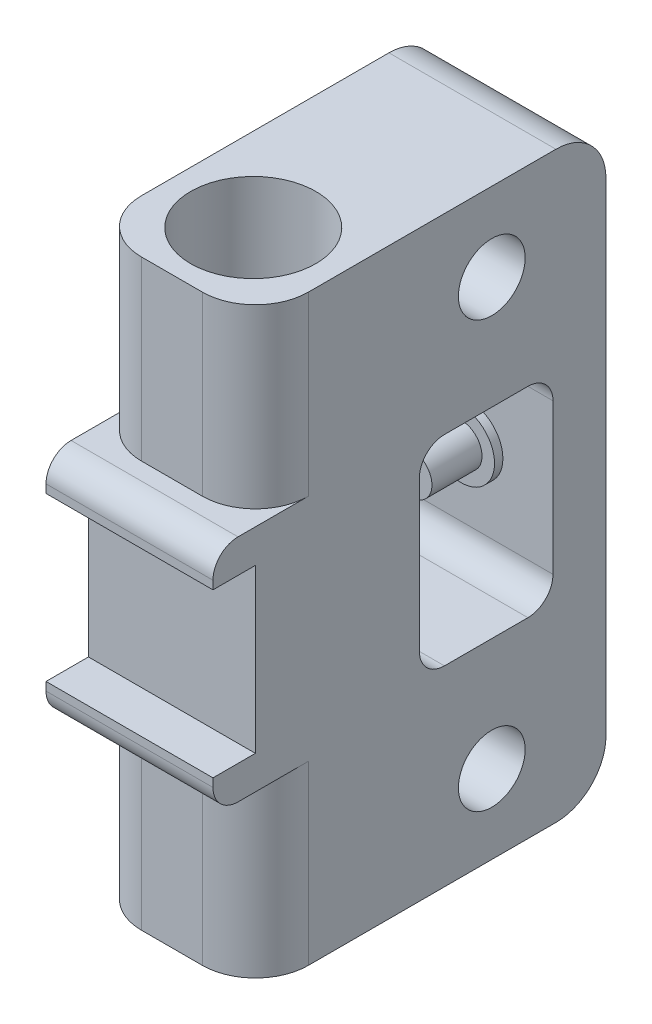
ISO-10303-21;
HEADER;
FILE_DESCRIPTION(('STEP AP214'),'2;1');
FILE_NAME('part.step','',(''),(''),'','','');
FILE_SCHEMA(('AUTOMOTIVE_DESIGN { 1 0 10303 214 1 1 1 1 }'));
ENDSEC;
DATA;
#1=APPLICATION_CONTEXT('core data for automotive mechanical design processes');
#2=APPLICATION_PROTOCOL_DEFINITION('international standard','automotive_design',2000,#1);
#3=PRODUCT_CONTEXT('',#1,'mechanical');
#4=PRODUCT('Part','Part','',(#3));
#5=PRODUCT_RELATED_PRODUCT_CATEGORY('part','',(#4));
#6=PRODUCT_DEFINITION_FORMATION('','',#4);
#7=PRODUCT_DEFINITION_CONTEXT('part definition',#1,'design');
#8=PRODUCT_DEFINITION('design','',#6,#7);
#9=PRODUCT_DEFINITION_SHAPE('','',#8);
#10=(LENGTH_UNIT() NAMED_UNIT(*) SI_UNIT(.MILLI.,.METRE.));
#11=(NAMED_UNIT(*) PLANE_ANGLE_UNIT() SI_UNIT($,.RADIAN.));
#12=(NAMED_UNIT(*) SI_UNIT($,.STERADIAN.) SOLID_ANGLE_UNIT());
#13=UNCERTAINTY_MEASURE_WITH_UNIT(LENGTH_MEASURE(1.E-05),#10,'distance_accuracy_value','');
#14=(GEOMETRIC_REPRESENTATION_CONTEXT(3) GLOBAL_UNCERTAINTY_ASSIGNED_CONTEXT((#13)) GLOBAL_UNIT_ASSIGNED_CONTEXT((#10,
#11,#12)) REPRESENTATION_CONTEXT('',''));
#15=CARTESIAN_POINT('',(0.,0.,0.));
#16=DIRECTION('',(0.,0.,1.));
#17=DIRECTION('',(1.,0.,0.));
#18=AXIS2_PLACEMENT_3D('',#15,#16,#17);
#19=CARTESIAN_POINT('',(-10.,69.85,21.));
#20=DIRECTION('',(0.,0.,-1.));
#21=DIRECTION('',(-1.,0.,0.));
#22=AXIS2_PLACEMENT_3D('',#19,#20,#21);
#23=PLANE('',#22);
#24=DIRECTION('',(-1.,0.,0.));
#25=VECTOR('',#24,1.);
#26=CARTESIAN_POINT('',(-10.,48.675,21.));
#27=LINE('',#26,#25);
#28=CARTESIAN_POINT('',(3.65,48.675,21.));
#29=VERTEX_POINT('',#28);
#30=CARTESIAN_POINT('',(-3.65,48.675,21.));
#31=VERTEX_POINT('',#30);
#32=EDGE_CURVE('E249',#29,#31,#27,.T.);
#33=ORIENTED_EDGE('',*,*,#32,.F.);
#34=DIRECTION('',(0.,-1.,0.));
#35=VECTOR('',#34,1.);
#36=CARTESIAN_POINT('',(3.65,69.85,21.));
#37=LINE('',#36,#35);
#38=CARTESIAN_POINT('',(3.65,69.85,21.));
#39=VERTEX_POINT('',#38);
#40=EDGE_CURVE('E366',#29,#39,#37,.F.);
#41=ORIENTED_EDGE('',*,*,#40,.T.);
#42=DIRECTION('',(1.,0.,0.));
#43=VECTOR('',#42,1.);
#44=CARTESIAN_POINT('',(-10.,69.85,21.));
#45=LINE('',#44,#43);
#46=CARTESIAN_POINT('',(-3.65,69.85,21.));
#47=VERTEX_POINT('',#46);
#48=EDGE_CURVE('E338',#47,#39,#45,.T.);
#49=ORIENTED_EDGE('',*,*,#48,.F.);
#50=DIRECTION('',(0.,-1.,0.));
#51=VECTOR('',#50,1.);
#52=CARTESIAN_POINT('',(-3.65,69.85,21.));
#53=LINE('',#52,#51);
#54=EDGE_CURVE('E363',#47,#31,#53,.T.);
#55=ORIENTED_EDGE('',*,*,#54,.T.);
#56=EDGE_LOOP('',(#33,#41,#49,#55));
#57=FACE_BOUND('',#56,.T.);
#58=ADVANCED_FACE('F32',(#57),#23,.F.);
#59=DIRECTION('',(1.,0.,0.));
#60=VECTOR('',#59,1.);
#61=CARTESIAN_POINT('',(-10.,44.675,21.));
#62=LINE('',#61,#60);
#63=CARTESIAN_POINT('',(-10.,44.675,21.));
#64=VERTEX_POINT('',#63);
#65=CARTESIAN_POINT('',(10.,44.675,21.));
#66=VERTEX_POINT('',#65);
#67=EDGE_CURVE('E227',#64,#66,#62,.T.);
#68=ORIENTED_EDGE('',*,*,#67,.F.);
#69=DIRECTION('',(0.,-1.,0.));
#70=VECTOR('',#69,1.);
#71=CARTESIAN_POINT('',(-10.,21.175,21.));
#72=LINE('',#71,#70);
#73=CARTESIAN_POINT('',(-10.,25.175,21.));
#74=VERTEX_POINT('',#73);
#75=EDGE_CURVE('E235',#64,#74,#72,.T.);
#76=ORIENTED_EDGE('',*,*,#75,.T.);
#77=DIRECTION('',(-1.,0.,0.));
#78=VECTOR('',#77,1.);
#79=CARTESIAN_POINT('',(-10.,25.175,21.));
#80=LINE('',#79,#78);
#81=CARTESIAN_POINT('',(10.,25.175,21.));
#82=VERTEX_POINT('',#81);
#83=EDGE_CURVE('E259',#82,#74,#80,.T.);
#84=ORIENTED_EDGE('',*,*,#83,.F.);
#85=DIRECTION('',(0.,1.,0.));
#86=VECTOR('',#85,1.);
#87=CARTESIAN_POINT('',(10.,21.175,21.));
#88=LINE('',#87,#86);
#89=EDGE_CURVE('E273',#82,#66,#88,.T.);
#90=ORIENTED_EDGE('',*,*,#89,.T.);
#91=EDGE_LOOP('',(#68,#76,#84,#90));
#92=FACE_BOUND('',#91,.T.);
#93=ADVANCED_FACE('F520',(#92),#23,.F.);
#94=DIRECTION('',(1.,0.,0.));
#95=VECTOR('',#94,1.);
#96=CARTESIAN_POINT('',(-10.,21.175,21.));
#97=LINE('',#96,#95);
#98=CARTESIAN_POINT('',(-3.65,21.175,21.));
#99=VERTEX_POINT('',#98);
#100=CARTESIAN_POINT('',(3.65,21.175,21.));
#101=VERTEX_POINT('',#100);
#102=EDGE_CURVE('E238',#99,#101,#97,.T.);
#103=ORIENTED_EDGE('',*,*,#102,.F.);
#104=CARTESIAN_POINT('',(-3.65,0.,21.));
#105=VERTEX_POINT('',#104);
#106=EDGE_CURVE('E362',#99,#105,#53,.T.);
#107=ORIENTED_EDGE('',*,*,#106,.T.);
#108=DIRECTION('',(1.,0.,0.));
#109=VECTOR('',#108,1.);
#110=CARTESIAN_POINT('',(-10.,0.,21.));
#111=LINE('',#110,#109);
#112=CARTESIAN_POINT('',(3.65,0.,21.));
#113=VERTEX_POINT('',#112);
#114=EDGE_CURVE('E335',#105,#113,#111,.T.);
#115=ORIENTED_EDGE('',*,*,#114,.T.);
#116=EDGE_CURVE('E367',#113,#101,#37,.F.);
#117=ORIENTED_EDGE('',*,*,#116,.T.);
#118=EDGE_LOOP('',(#103,#107,#115,#117));
#119=FACE_BOUND('',#118,.T.);
#120=ADVANCED_FACE('F522',(#119),#23,.F.);
#121=CARTESIAN_POINT('',(3.65,69.85,14.65));
#122=DIRECTION('',(0.,-1.,0.));
#123=DIRECTION('',(0.,0.,-1.));
#124=AXIS2_PLACEMENT_3D('',#121,#122,#123);
#125=CYLINDRICAL_SURFACE('',#124,6.35);
#126=CARTESIAN_POINT('',(3.65,48.675,14.65));
#127=DIRECTION('',(0.,1.,0.));
#128=DIRECTION('',(0.,0.,1.));
#129=AXIS2_PLACEMENT_3D('',#126,#127,#128);
#130=CIRCLE('',#129,6.35);
#131=CARTESIAN_POINT('',(10.,48.675,14.65));
#132=VERTEX_POINT('',#131);
#133=EDGE_CURVE('E288',#132,#29,#130,.F.);
#134=ORIENTED_EDGE('',*,*,#133,.F.);
#135=DIRECTION('',(0.,-1.,0.));
#136=VECTOR('',#135,1.);
#137=CARTESIAN_POINT('',(10.,69.85,14.65));
#138=LINE('',#137,#136);
#139=CARTESIAN_POINT('',(10.,69.85,14.65));
#140=VERTEX_POINT('',#139);
#141=EDGE_CURVE('E354',#140,#132,#138,.T.);
#142=ORIENTED_EDGE('',*,*,#141,.F.);
#143=CARTESIAN_POINT('',(3.65,69.85,14.65));
#144=DIRECTION('',(0.,-1.,0.));
#145=DIRECTION('',(0.,0.,-1.));
#146=AXIS2_PLACEMENT_3D('',#143,#144,#145);
#147=CIRCLE('',#146,6.35);
#148=EDGE_CURVE('E372',#39,#140,#147,.F.);
#149=ORIENTED_EDGE('',*,*,#148,.F.);
#150=ORIENTED_EDGE('',*,*,#40,.F.);
#151=EDGE_LOOP('',(#134,#142,#149,#150));
#152=FACE_BOUND('',#151,.T.);
#153=ADVANCED_FACE('F504',(#152),#125,.T.);
#154=CARTESIAN_POINT('',(-3.65,69.85,14.65));
#155=DIRECTION('',(0.,-1.,0.));
#156=DIRECTION('',(0.,0.,-1.));
#157=AXIS2_PLACEMENT_3D('',#154,#155,#156);
#158=CYLINDRICAL_SURFACE('',#157,6.35);
#159=CARTESIAN_POINT('',(-3.65,48.675,14.65));
#160=DIRECTION('',(0.,1.,0.));
#161=DIRECTION('',(0.,0.,1.));
#162=AXIS2_PLACEMENT_3D('',#159,#160,#161);
#163=CIRCLE('',#162,6.35);
#164=CARTESIAN_POINT('',(-10.,48.675,14.65));
#165=VERTEX_POINT('',#164);
#166=EDGE_CURVE('E447',#31,#165,#163,.F.);
#167=ORIENTED_EDGE('',*,*,#166,.F.);
#168=ORIENTED_EDGE('',*,*,#54,.F.);
#169=CARTESIAN_POINT('',(-3.65,69.85,14.65));
#170=DIRECTION('',(0.,-1.,0.));
#171=DIRECTION('',(0.,0.,-1.));
#172=AXIS2_PLACEMENT_3D('',#169,#170,#171);
#173=CIRCLE('',#172,6.35);
#174=CARTESIAN_POINT('',(-10.,69.85,14.65));
#175=VERTEX_POINT('',#174);
#176=EDGE_CURVE('E370',#175,#47,#173,.F.);
#177=ORIENTED_EDGE('',*,*,#176,.F.);
#178=DIRECTION('',(0.,-1.,0.));
#179=VECTOR('',#178,1.);
#180=CARTESIAN_POINT('',(-10.,69.85,14.65));
#181=LINE('',#180,#179);
#182=EDGE_CURVE('E374',#165,#175,#181,.F.);
#183=ORIENTED_EDGE('',*,*,#182,.F.);
#184=EDGE_LOOP('',(#167,#168,#177,#183));
#185=FACE_BOUND('',#184,.T.);
#186=ADVANCED_FACE('F516',(#185),#158,.T.);
#187=CARTESIAN_POINT('',(10.,69.85,21.));
#188=DIRECTION('',(-1.,0.,0.));
#189=DIRECTION('',(0.,0.,1.));
#190=AXIS2_PLACEMENT_3D('',#187,#188,#189);
#191=PLANE('',#190);
#192=DIRECTION('',(0.,0.,1.));
#193=VECTOR('',#192,1.);
#194=CARTESIAN_POINT('',(10.,48.675,14.65));
#195=LINE('',#194,#193);
#196=CARTESIAN_POINT('',(10.,48.675,23.08));
#197=VERTEX_POINT('',#196);
#198=EDGE_CURVE('E280',#132,#197,#195,.T.);
#199=ORIENTED_EDGE('',*,*,#198,.T.);
#200=CARTESIAN_POINT('',(10.,45.675,23.08));
#201=DIRECTION('',(-1.,0.,0.));
#202=DIRECTION('',(0.,0.,1.));
#203=AXIS2_PLACEMENT_3D('',#200,#201,#202);
#204=CIRCLE('',#203,3.);
#205=CARTESIAN_POINT('',(10.,45.675,26.08));
#206=VERTEX_POINT('',#205);
#207=EDGE_CURVE('E457',#197,#206,#204,.F.);
#208=ORIENTED_EDGE('',*,*,#207,.T.);
#209=DIRECTION('',(0.,1.,0.));
#210=VECTOR('',#209,1.);
#211=CARTESIAN_POINT('',(10.,48.675,26.08));
#212=LINE('',#211,#210);
#213=CARTESIAN_POINT('',(10.,44.675,26.08));
#214=VERTEX_POINT('',#213);
#215=EDGE_CURVE('E244',#214,#206,#212,.T.);
#216=ORIENTED_EDGE('',*,*,#215,.F.);
#217=DIRECTION('',(0.,0.,-1.));
#218=VECTOR('',#217,1.);
#219=CARTESIAN_POINT('',(10.,44.675,26.08));
#220=LINE('',#219,#218);
#221=EDGE_CURVE('E239',#214,#66,#220,.T.);
#222=ORIENTED_EDGE('',*,*,#221,.T.);
#223=ORIENTED_EDGE('',*,*,#89,.F.);
#224=DIRECTION('',(0.,0.,-1.));
#225=VECTOR('',#224,1.);
#226=CARTESIAN_POINT('',(10.,25.175,26.08));
#227=LINE('',#226,#225);
#228=CARTESIAN_POINT('',(10.,25.175,26.08));
#229=VERTEX_POINT('',#228);
#230=EDGE_CURVE('E269',#229,#82,#227,.T.);
#231=ORIENTED_EDGE('',*,*,#230,.F.);
#232=DIRECTION('',(0.,1.,0.));
#233=VECTOR('',#232,1.);
#234=CARTESIAN_POINT('',(10.,21.175,26.08));
#235=LINE('',#234,#233);
#236=CARTESIAN_POINT('',(10.,24.175,26.08));
#237=VERTEX_POINT('',#236);
#238=EDGE_CURVE('E258',#237,#229,#235,.T.);
#239=ORIENTED_EDGE('',*,*,#238,.F.);
#240=CARTESIAN_POINT('',(10.,24.175,23.08));
#241=DIRECTION('',(-1.,0.,0.));
#242=DIRECTION('',(0.,0.,1.));
#243=AXIS2_PLACEMENT_3D('',#240,#241,#242);
#244=CIRCLE('',#243,3.);
#245=CARTESIAN_POINT('',(10.,21.175,23.08));
#246=VERTEX_POINT('',#245);
#247=EDGE_CURVE('E47',#237,#246,#244,.F.);
#248=ORIENTED_EDGE('',*,*,#247,.T.);
#249=DIRECTION('',(0.,0.,1.));
#250=VECTOR('',#249,1.);
#251=CARTESIAN_POINT('',(10.,21.175,14.65));
#252=LINE('',#251,#250);
#253=CARTESIAN_POINT('',(10.,21.175,14.65));
#254=VERTEX_POINT('',#253);
#255=EDGE_CURVE('E283',#254,#246,#252,.T.);
#256=ORIENTED_EDGE('',*,*,#255,.F.);
#257=CARTESIAN_POINT('',(10.,0.,14.65));
#258=VERTEX_POINT('',#257);
#259=EDGE_CURVE('E353',#254,#258,#138,.T.);
#260=ORIENTED_EDGE('',*,*,#259,.T.);
#261=DIRECTION('',(0.,0.,-1.));
#262=VECTOR('',#261,1.);
#263=CARTESIAN_POINT('',(10.,0.,21.));
#264=LINE('',#263,#262);
#265=CARTESIAN_POINT('',(10.,0.,-15.));
#266=VERTEX_POINT('',#265);
#267=EDGE_CURVE('E330',#258,#266,#264,.T.);
#268=ORIENTED_EDGE('',*,*,#267,.T.);
#269=CARTESIAN_POINT('',(10.,6.00000000000001,-15.));
#270=DIRECTION('',(-1.,0.,0.));
#271=DIRECTION('',(0.,0.,1.));
#272=AXIS2_PLACEMENT_3D('',#269,#270,#271);
#273=CIRCLE('',#272,6.);
#274=CARTESIAN_POINT('',(10.,6.00000000000001,-21.));
#275=VERTEX_POINT('',#274);
#276=EDGE_CURVE('E399',#266,#275,#273,.F.);
#277=ORIENTED_EDGE('',*,*,#276,.T.);
#278=DIRECTION('',(0.,-1.,0.));
#279=VECTOR('',#278,1.);
#280=CARTESIAN_POINT('',(10.,69.85,-21.));
#281=LINE('',#280,#279);
#282=CARTESIAN_POINT('',(10.,63.85,-21.));
#283=VERTEX_POINT('',#282);
#284=EDGE_CURVE('E350',#283,#275,#281,.T.);
#285=ORIENTED_EDGE('',*,*,#284,.F.);
#286=CARTESIAN_POINT('',(10.,63.85,-15.));
#287=DIRECTION('',(-1.,0.,0.));
#288=DIRECTION('',(0.,0.,1.));
#289=AXIS2_PLACEMENT_3D('',#286,#287,#288);
#290=CIRCLE('',#289,6.);
#291=CARTESIAN_POINT('',(10.,69.85,-15.));
#292=VERTEX_POINT('',#291);
#293=EDGE_CURVE('E401',#283,#292,#290,.F.);
#294=ORIENTED_EDGE('',*,*,#293,.T.);
#295=DIRECTION('',(0.,0.,-1.));
#296=VECTOR('',#295,1.);
#297=CARTESIAN_POINT('',(10.,69.85,21.));
#298=LINE('',#297,#296);
#299=EDGE_CURVE('E331',#140,#292,#298,.T.);
#300=ORIENTED_EDGE('',*,*,#299,.F.);
#301=ORIENTED_EDGE('',*,*,#141,.T.);
#302=EDGE_LOOP('',(#199,#208,#216,#222,#223,#231,#239,#248,#256,#260,#268,#277,#285,#294,#300,#301));
#303=FACE_BOUND('',#302,.T.);
#304=CARTESIAN_POINT('',(10.,60.425,-7.31821536224331));
#305=DIRECTION('',(1.,0.,0.));
#306=DIRECTION('',(0.,0.,-1.));
#307=AXIS2_PLACEMENT_3D('',#304,#305,#306);
#308=CIRCLE('',#307,4.);
#309=CARTESIAN_POINT('',(10.,60.425,-11.3182153622433));
#310=VERTEX_POINT('',#309);
#311=EDGE_CURVE('E311',#310,#310,#308,.T.);
#312=ORIENTED_EDGE('',*,*,#311,.F.);
#313=EDGE_LOOP('',(#312));
#314=FACE_BOUND('',#313,.T.);
#315=CARTESIAN_POINT('',(10.,43.925,-11.65));
#316=DIRECTION('',(-1.,0.,0.));
#317=DIRECTION('',(0.,0.,1.));
#318=AXIS2_PLACEMENT_3D('',#315,#316,#317);
#319=CIRCLE('',#318,3.);
#320=CARTESIAN_POINT('',(10.,46.925,-11.65));
#321=VERTEX_POINT('',#320);
#322=CARTESIAN_POINT('',(10.,43.925,-14.65));
#323=VERTEX_POINT('',#322);
#324=EDGE_CURVE('E426',#321,#323,#319,.T.);
#325=ORIENTED_EDGE('',*,*,#324,.T.);
#326=DIRECTION('',(0.,-1.,0.));
#327=VECTOR('',#326,1.);
#328=CARTESIAN_POINT('',(10.,0.,-14.65));
#329=LINE('',#328,#327);
#330=CARTESIAN_POINT('',(10.,25.925,-14.65));
#331=VERTEX_POINT('',#330);
#332=EDGE_CURVE('E305',#323,#331,#329,.T.);
#333=ORIENTED_EDGE('',*,*,#332,.T.);
#334=CARTESIAN_POINT('',(10.,25.925,-11.65));
#335=DIRECTION('',(-1.,0.,0.));
#336=DIRECTION('',(0.,0.,1.));
#337=AXIS2_PLACEMENT_3D('',#334,#335,#336);
#338=CIRCLE('',#337,3.);
#339=CARTESIAN_POINT('',(10.,22.925,-11.65));
#340=VERTEX_POINT('',#339);
#341=EDGE_CURVE('E439',#331,#340,#338,.T.);
#342=ORIENTED_EDGE('',*,*,#341,.T.);
#343=DIRECTION('',(0.,0.,-1.));
#344=VECTOR('',#343,1.);
#345=CARTESIAN_POINT('',(10.,22.925,1.35));
#346=LINE('',#345,#344);
#347=CARTESIAN_POINT('',(10.,22.925,-1.65));
#348=VERTEX_POINT('',#347);
#349=EDGE_CURVE('E321',#348,#340,#346,.T.);
#350=ORIENTED_EDGE('',*,*,#349,.F.);
#351=CARTESIAN_POINT('',(10.,25.925,-1.65));
#352=DIRECTION('',(-1.,0.,0.));
#353=DIRECTION('',(0.,0.,1.));
#354=AXIS2_PLACEMENT_3D('',#351,#352,#353);
#355=CIRCLE('',#354,3.);
#356=CARTESIAN_POINT('',(10.,25.925,1.35));
#357=VERTEX_POINT('',#356);
#358=EDGE_CURVE('E435',#348,#357,#355,.T.);
#359=ORIENTED_EDGE('',*,*,#358,.T.);
#360=DIRECTION('',(0.,-1.,0.));
#361=VECTOR('',#360,1.);
#362=CARTESIAN_POINT('',(10.,22.925,1.35));
#363=LINE('',#362,#361);
#364=CARTESIAN_POINT('',(10.,43.925,1.35));
#365=VERTEX_POINT('',#364);
#366=EDGE_CURVE('E318',#365,#357,#363,.T.);
#367=ORIENTED_EDGE('',*,*,#366,.F.);
#368=CARTESIAN_POINT('',(10.,43.925,-1.65));
#369=DIRECTION('',(-1.,0.,0.));
#370=DIRECTION('',(0.,0.,1.));
#371=AXIS2_PLACEMENT_3D('',#368,#369,#370);
#372=CIRCLE('',#371,3.);
#373=CARTESIAN_POINT('',(10.,46.925,-1.65));
#374=VERTEX_POINT('',#373);
#375=EDGE_CURVE('E431',#365,#374,#372,.T.);
#376=ORIENTED_EDGE('',*,*,#375,.T.);
#377=DIRECTION('',(0.,0.,1.));
#378=VECTOR('',#377,1.);
#379=CARTESIAN_POINT('',(10.,46.925,1.35));
#380=LINE('',#379,#378);
#381=EDGE_CURVE('E315',#321,#374,#380,.T.);
#382=ORIENTED_EDGE('',*,*,#381,.F.);
#383=EDGE_LOOP('',(#325,#333,#342,#350,#359,#367,#376,#382));
#384=FACE_BOUND('',#383,.T.);
#385=CARTESIAN_POINT('',(10.,9.425,-7.31821536224331));
#386=DIRECTION('',(1.,0.,0.));
#387=DIRECTION('',(0.,0.,1.));
#388=AXIS2_PLACEMENT_3D('',#385,#386,#387);
#389=CIRCLE('',#388,4.);
#390=CARTESIAN_POINT('',(10.,9.425,-3.31821536224331));
#391=VERTEX_POINT('',#390);
#392=EDGE_CURVE('E307',#391,#391,#389,.T.);
#393=ORIENTED_EDGE('',*,*,#392,.F.);
#394=EDGE_LOOP('',(#393));
#395=FACE_BOUND('',#394,.T.);
#396=ADVANCED_FACE('F463',(#303,#314,#384,#395),#191,.F.);
#397=CARTESIAN_POINT('',(-10.,69.85,-21.));
#398=DIRECTION('',(0.,0.,1.));
#399=DIRECTION('',(1.,0.,0.));
#400=AXIS2_PLACEMENT_3D('',#397,#398,#399);
#401=PLANE('',#400);
#402=DIRECTION('',(0.,-1.,0.));
#403=VECTOR('',#402,1.);
#404=CARTESIAN_POINT('',(-10.,69.85,-21.));
#405=LINE('',#404,#403);
#406=CARTESIAN_POINT('',(-10.,63.85,-21.));
#407=VERTEX_POINT('',#406);
#408=CARTESIAN_POINT('',(-10.,6.00000000000001,-21.));
#409=VERTEX_POINT('',#408);
#410=EDGE_CURVE('E341',#407,#409,#405,.T.);
#411=ORIENTED_EDGE('',*,*,#410,.F.);
#412=DIRECTION('',(-1.,0.,0.));
#413=VECTOR('',#412,1.);
#414=CARTESIAN_POINT('',(-10.,63.85,-21.));
#415=LINE('',#414,#413);
#416=EDGE_CURVE('E396',#407,#283,#415,.F.);
#417=ORIENTED_EDGE('',*,*,#416,.T.);
#418=ORIENTED_EDGE('',*,*,#284,.T.);
#419=DIRECTION('',(-1.,0.,0.));
#420=VECTOR('',#419,1.);
#421=CARTESIAN_POINT('',(-10.,6.00000000000001,-21.));
#422=LINE('',#421,#420);
#423=EDGE_CURVE('E393',#275,#409,#422,.T.);
#424=ORIENTED_EDGE('',*,*,#423,.T.);
#425=EDGE_LOOP('',(#411,#417,#418,#424));
#426=FACE_BOUND('',#425,.T.);
#427=ADVANCED_FACE('F489',(#426),#401,.F.);
#428=CARTESIAN_POINT('',(-10.,69.85,21.));
#429=DIRECTION('',(1.,0.,0.));
#430=DIRECTION('',(0.,0.,-1.));
#431=AXIS2_PLACEMENT_3D('',#428,#429,#430);
#432=PLANE('',#431);
#433=DIRECTION('',(0.,-1.,0.));
#434=VECTOR('',#433,1.);
#435=CARTESIAN_POINT('',(-10.,48.675,26.08));
#436=LINE('',#435,#434);
#437=CARTESIAN_POINT('',(-10.,45.675,26.08));
#438=VERTEX_POINT('',#437);
#439=CARTESIAN_POINT('',(-10.,44.675,26.08));
#440=VERTEX_POINT('',#439);
#441=EDGE_CURVE('E217',#438,#440,#436,.T.);
#442=ORIENTED_EDGE('',*,*,#441,.F.);
#443=CARTESIAN_POINT('',(-10.,45.675,23.08));
#444=DIRECTION('',(1.,0.,0.));
#445=DIRECTION('',(0.,0.,-1.));
#446=AXIS2_PLACEMENT_3D('',#443,#444,#445);
#447=CIRCLE('',#446,3.);
#448=CARTESIAN_POINT('',(-10.,48.675,23.08));
#449=VERTEX_POINT('',#448);
#450=EDGE_CURVE('E452',#438,#449,#447,.F.);
#451=ORIENTED_EDGE('',*,*,#450,.T.);
#452=DIRECTION('',(0.,0.,1.));
#453=VECTOR('',#452,1.);
#454=CARTESIAN_POINT('',(-10.,48.675,14.65));
#455=LINE('',#454,#453);
#456=EDGE_CURVE('E276',#165,#449,#455,.T.);
#457=ORIENTED_EDGE('',*,*,#456,.F.);
#458=ORIENTED_EDGE('',*,*,#182,.T.);
#459=DIRECTION('',(0.,0.,1.));
#460=VECTOR('',#459,1.);
#461=CARTESIAN_POINT('',(-10.,69.85,21.));
#462=LINE('',#461,#460);
#463=CARTESIAN_POINT('',(-10.,69.85,-15.));
#464=VERTEX_POINT('',#463);
#465=EDGE_CURVE('E334',#464,#175,#462,.T.);
#466=ORIENTED_EDGE('',*,*,#465,.F.);
#467=CARTESIAN_POINT('',(-10.,63.85,-15.));
#468=DIRECTION('',(1.,0.,0.));
#469=DIRECTION('',(0.,0.,-1.));
#470=AXIS2_PLACEMENT_3D('',#467,#468,#469);
#471=CIRCLE('',#470,6.);
#472=EDGE_CURVE('E390',#464,#407,#471,.F.);
#473=ORIENTED_EDGE('',*,*,#472,.T.);
#474=ORIENTED_EDGE('',*,*,#410,.T.);
#475=CARTESIAN_POINT('',(-10.,6.00000000000001,-15.));
#476=DIRECTION('',(1.,0.,0.));
#477=DIRECTION('',(0.,0.,-1.));
#478=AXIS2_PLACEMENT_3D('',#475,#476,#477);
#479=CIRCLE('',#478,6.);
#480=CARTESIAN_POINT('',(-10.,0.,-15.));
#481=VERTEX_POINT('',#480);
#482=EDGE_CURVE('E388',#409,#481,#479,.F.);
#483=ORIENTED_EDGE('',*,*,#482,.T.);
#484=DIRECTION('',(0.,0.,1.));
#485=VECTOR('',#484,1.);
#486=CARTESIAN_POINT('',(-10.,0.,21.));
#487=LINE('',#486,#485);
#488=CARTESIAN_POINT('',(-10.,0.,14.65));
#489=VERTEX_POINT('',#488);
#490=EDGE_CURVE('E344',#481,#489,#487,.T.);
#491=ORIENTED_EDGE('',*,*,#490,.T.);
#492=CARTESIAN_POINT('',(-10.,21.175,14.65));
#493=VERTEX_POINT('',#492);
#494=EDGE_CURVE('E375',#489,#493,#181,.F.);
#495=ORIENTED_EDGE('',*,*,#494,.T.);
#496=DIRECTION('',(0.,0.,1.));
#497=VECTOR('',#496,1.);
#498=CARTESIAN_POINT('',(-10.,21.175,14.65));
#499=LINE('',#498,#497);
#500=CARTESIAN_POINT('',(-10.,21.175,23.08));
#501=VERTEX_POINT('',#500);
#502=EDGE_CURVE('E275',#493,#501,#499,.T.);
#503=ORIENTED_EDGE('',*,*,#502,.T.);
#504=CARTESIAN_POINT('',(-10.,24.175,23.08));
#505=DIRECTION('',(1.,0.,0.));
#506=DIRECTION('',(0.,0.,-1.));
#507=AXIS2_PLACEMENT_3D('',#504,#505,#506);
#508=CIRCLE('',#507,3.);
#509=CARTESIAN_POINT('',(-10.,24.175,26.08));
#510=VERTEX_POINT('',#509);
#511=EDGE_CURVE('E450',#501,#510,#508,.F.);
#512=ORIENTED_EDGE('',*,*,#511,.T.);
#513=DIRECTION('',(0.,-1.,0.));
#514=VECTOR('',#513,1.);
#515=CARTESIAN_POINT('',(-10.,21.175,26.08));
#516=LINE('',#515,#514);
#517=CARTESIAN_POINT('',(-10.,25.175,26.08));
#518=VERTEX_POINT('',#517);
#519=EDGE_CURVE('E255',#518,#510,#516,.T.);
#520=ORIENTED_EDGE('',*,*,#519,.F.);
#521=DIRECTION('',(0.,0.,-1.));
#522=VECTOR('',#521,1.);
#523=CARTESIAN_POINT('',(-10.,25.175,26.08));
#524=LINE('',#523,#522);
#525=EDGE_CURVE('E263',#518,#74,#524,.T.);
#526=ORIENTED_EDGE('',*,*,#525,.T.);
#527=ORIENTED_EDGE('',*,*,#75,.F.);
#528=DIRECTION('',(0.,0.,-1.));
#529=VECTOR('',#528,1.);
#530=CARTESIAN_POINT('',(-10.,44.675,26.08));
#531=LINE('',#530,#529);
#532=EDGE_CURVE('E231',#440,#64,#531,.T.);
#533=ORIENTED_EDGE('',*,*,#532,.F.);
#534=EDGE_LOOP('',(#442,#451,#457,#458,#466,#473,#474,#483,#491,#495,#503,#512,#520,#526,#527,#533));
#535=FACE_BOUND('',#534,.T.);
#536=CARTESIAN_POINT('',(-10.,60.425,-7.31821536224331));
#537=DIRECTION('',(1.,0.,0.));
#538=DIRECTION('',(0.,0.,-1.));
#539=AXIS2_PLACEMENT_3D('',#536,#537,#538);
#540=CIRCLE('',#539,4.);
#541=CARTESIAN_POINT('',(-10.,60.425,-11.3182153622433));
#542=VERTEX_POINT('',#541);
#543=EDGE_CURVE('E314',#542,#542,#540,.T.);
#544=ORIENTED_EDGE('',*,*,#543,.T.);
#545=EDGE_LOOP('',(#544));
#546=FACE_BOUND('',#545,.T.);
#547=CARTESIAN_POINT('',(-10.,9.425,-7.31821536224331));
#548=DIRECTION('',(1.,0.,0.));
#549=DIRECTION('',(0.,0.,-1.));
#550=AXIS2_PLACEMENT_3D('',#547,#548,#549);
#551=CIRCLE('',#550,4.);
#552=CARTESIAN_POINT('',(-10.,9.425,-11.3182153622433));
#553=VERTEX_POINT('',#552);
#554=EDGE_CURVE('E310',#553,#553,#551,.T.);
#555=ORIENTED_EDGE('',*,*,#554,.T.);
#556=EDGE_LOOP('',(#555));
#557=FACE_BOUND('',#556,.T.);
#558=CARTESIAN_POINT('',(-10.,25.925,-11.65));
#559=DIRECTION('',(1.,0.,0.));
#560=DIRECTION('',(0.,0.,-1.));
#561=AXIS2_PLACEMENT_3D('',#558,#559,#560);
#562=CIRCLE('',#561,3.);
#563=CARTESIAN_POINT('',(-10.,22.925,-11.65));
#564=VERTEX_POINT('',#563);
#565=CARTESIAN_POINT('',(-9.99999999999999,25.925,-14.65));
#566=VERTEX_POINT('',#565);
#567=EDGE_CURVE('E441',#564,#566,#562,.T.);
#568=ORIENTED_EDGE('',*,*,#567,.T.);
#569=DIRECTION('',(0.,1.,0.));
#570=VECTOR('',#569,1.);
#571=CARTESIAN_POINT('',(-9.99999999999999,0.,-14.65));
#572=LINE('',#571,#570);
#573=CARTESIAN_POINT('',(-10.,43.925,-14.65));
#574=VERTEX_POINT('',#573);
#575=EDGE_CURVE('E301',#566,#574,#572,.T.);
#576=ORIENTED_EDGE('',*,*,#575,.T.);
#577=CARTESIAN_POINT('',(-10.,43.925,-11.65));
#578=DIRECTION('',(1.,0.,0.));
#579=DIRECTION('',(0.,0.,-1.));
#580=AXIS2_PLACEMENT_3D('',#577,#578,#579);
#581=CIRCLE('',#580,3.);
#582=CARTESIAN_POINT('',(-10.,46.925,-11.65));
#583=VERTEX_POINT('',#582);
#584=EDGE_CURVE('E429',#574,#583,#581,.T.);
#585=ORIENTED_EDGE('',*,*,#584,.T.);
#586=DIRECTION('',(0.,0.,1.));
#587=VECTOR('',#586,1.);
#588=CARTESIAN_POINT('',(-10.,46.925,21.));
#589=LINE('',#588,#587);
#590=CARTESIAN_POINT('',(-10.,46.925,-1.65));
#591=VERTEX_POINT('',#590);
#592=EDGE_CURVE('E324',#583,#591,#589,.T.);
#593=ORIENTED_EDGE('',*,*,#592,.T.);
#594=CARTESIAN_POINT('',(-10.,43.925,-1.65));
#595=DIRECTION('',(1.,0.,0.));
#596=DIRECTION('',(0.,0.,-1.));
#597=AXIS2_PLACEMENT_3D('',#594,#595,#596);
#598=CIRCLE('',#597,3.);
#599=CARTESIAN_POINT('',(-10.,43.925,1.35));
#600=VERTEX_POINT('',#599);
#601=EDGE_CURVE('E433',#591,#600,#598,.T.);
#602=ORIENTED_EDGE('',*,*,#601,.T.);
#603=DIRECTION('',(0.,-1.,0.));
#604=VECTOR('',#603,1.);
#605=CARTESIAN_POINT('',(-10.,69.85,1.35));
#606=LINE('',#605,#604);
#607=CARTESIAN_POINT('',(-10.,25.925,1.35));
#608=VERTEX_POINT('',#607);
#609=EDGE_CURVE('E378',#600,#608,#606,.T.);
#610=ORIENTED_EDGE('',*,*,#609,.T.);
#611=CARTESIAN_POINT('',(-10.,25.925,-1.65));
#612=DIRECTION('',(1.,0.,0.));
#613=DIRECTION('',(0.,0.,-1.));
#614=AXIS2_PLACEMENT_3D('',#611,#612,#613);
#615=CIRCLE('',#614,3.);
#616=CARTESIAN_POINT('',(-10.,22.925,-1.65));
#617=VERTEX_POINT('',#616);
#618=EDGE_CURVE('E437',#608,#617,#615,.T.);
#619=ORIENTED_EDGE('',*,*,#618,.T.);
#620=DIRECTION('',(0.,0.,-1.));
#621=VECTOR('',#620,1.);
#622=CARTESIAN_POINT('',(-10.,22.925,21.));
#623=LINE('',#622,#621);
#624=EDGE_CURVE('E327',#617,#564,#623,.T.);
#625=ORIENTED_EDGE('',*,*,#624,.T.);
#626=EDGE_LOOP('',(#568,#576,#585,#593,#602,#610,#619,#625));
#627=FACE_BOUND('',#626,.T.);
#628=ADVANCED_FACE('F232',(#535,#546,#557,#627),#432,.F.);
#629=CARTESIAN_POINT('',(0.,69.85,0.));
#630=DIRECTION('',(0.,-1.,0.));
#631=DIRECTION('',(0.,0.,-1.));
#632=AXIS2_PLACEMENT_3D('',#629,#630,#631);
#633=PLANE('',#632);
#634=CARTESIAN_POINT('',(0.,69.85,11.254449914184));
#635=DIRECTION('',(0.,1.,0.));
#636=DIRECTION('',(0.,0.,1.));
#637=AXIS2_PLACEMENT_3D('',#634,#635,#636);
#638=CIRCLE('',#637,7.5);
#639=CARTESIAN_POINT('',(0.,69.85,18.754449914184));
#640=VERTEX_POINT('',#639);
#641=EDGE_CURVE('E630',#640,#640,#638,.T.);
#642=ORIENTED_EDGE('',*,*,#641,.F.);
#643=EDGE_LOOP('',(#642));
#644=FACE_BOUND('',#643,.T.);
#645=ORIENTED_EDGE('',*,*,#299,.T.);
#646=DIRECTION('',(-1.,0.,0.));
#647=VECTOR('',#646,1.);
#648=CARTESIAN_POINT('',(0.,69.85,-15.));
#649=LINE('',#648,#647);
#650=EDGE_CURVE('E381',#292,#464,#649,.T.);
#651=ORIENTED_EDGE('',*,*,#650,.T.);
#652=ORIENTED_EDGE('',*,*,#465,.T.);
#653=ORIENTED_EDGE('',*,*,#176,.T.);
#654=ORIENTED_EDGE('',*,*,#48,.T.);
#655=ORIENTED_EDGE('',*,*,#148,.T.);
#656=EDGE_LOOP('',(#645,#651,#652,#653,#654,#655));
#657=FACE_BOUND('',#656,.T.);
#658=ADVANCED_FACE('F499',(#644,#657),#633,.F.);
#659=CARTESIAN_POINT('',(0.,0.,0.));
#660=DIRECTION('',(0.,-1.,0.));
#661=DIRECTION('',(0.,0.,-1.));
#662=AXIS2_PLACEMENT_3D('',#659,#660,#661);
#663=PLANE('',#662);
#664=CARTESIAN_POINT('',(0.,0.,11.254449914184));
#665=DIRECTION('',(0.,1.,0.));
#666=DIRECTION('',(0.,0.,1.));
#667=AXIS2_PLACEMENT_3D('',#664,#665,#666);
#668=CIRCLE('',#667,7.5);
#669=CARTESIAN_POINT('',(0.,0.,18.754449914184));
#670=VERTEX_POINT('',#669);
#671=EDGE_CURVE('E252',#670,#670,#668,.T.);
#672=ORIENTED_EDGE('',*,*,#671,.T.);
#673=EDGE_LOOP('',(#672));
#674=FACE_BOUND('',#673,.T.);
#675=ORIENTED_EDGE('',*,*,#490,.F.);
#676=DIRECTION('',(-1.,0.,0.));
#677=VECTOR('',#676,1.);
#678=CARTESIAN_POINT('',(10.,0.,-15.));
#679=LINE('',#678,#677);
#680=EDGE_CURVE('E403',#481,#266,#679,.F.);
#681=ORIENTED_EDGE('',*,*,#680,.T.);
#682=ORIENTED_EDGE('',*,*,#267,.F.);
#683=CARTESIAN_POINT('',(3.65,0.,14.65));
#684=DIRECTION('',(0.,-1.,0.));
#685=DIRECTION('',(0.,0.,-1.));
#686=AXIS2_PLACEMENT_3D('',#683,#684,#685);
#687=CIRCLE('',#686,6.35);
#688=EDGE_CURVE('E360',#258,#113,#687,.T.);
#689=ORIENTED_EDGE('',*,*,#688,.T.);
#690=ORIENTED_EDGE('',*,*,#114,.F.);
#691=CARTESIAN_POINT('',(-3.65,0.,14.65));
#692=DIRECTION('',(0.,-1.,0.));
#693=DIRECTION('',(0.,0.,-1.));
#694=AXIS2_PLACEMENT_3D('',#691,#692,#693);
#695=CIRCLE('',#694,6.35);
#696=EDGE_CURVE('E357',#105,#489,#695,.T.);
#697=ORIENTED_EDGE('',*,*,#696,.T.);
#698=EDGE_LOOP('',(#675,#681,#682,#689,#690,#697));
#699=FACE_BOUND('',#698,.T.);
#700=ADVANCED_FACE('F482',(#674,#699),#663,.T.);
#701=CARTESIAN_POINT('',(3.65,21.175,14.65));
#702=DIRECTION('',(0.,-1.,0.));
#703=DIRECTION('',(0.,0.,-1.));
#704=AXIS2_PLACEMENT_3D('',#701,#702,#703);
#705=CIRCLE('',#704,6.35);
#706=EDGE_CURVE('E279',#101,#254,#705,.F.);
#707=ORIENTED_EDGE('',*,*,#706,.F.);
#708=ORIENTED_EDGE('',*,*,#116,.F.);
#709=ORIENTED_EDGE('',*,*,#688,.F.);
#710=ORIENTED_EDGE('',*,*,#259,.F.);
#711=EDGE_LOOP('',(#707,#708,#709,#710));
#712=FACE_BOUND('',#711,.T.);
#713=ADVANCED_FACE('F476',(#712),#125,.T.);
#714=CARTESIAN_POINT('',(-3.65,21.175,14.65));
#715=DIRECTION('',(0.,-1.,0.));
#716=DIRECTION('',(0.,0.,-1.));
#717=AXIS2_PLACEMENT_3D('',#714,#715,#716);
#718=CIRCLE('',#717,6.35);
#719=EDGE_CURVE('E444',#493,#99,#718,.F.);
#720=ORIENTED_EDGE('',*,*,#719,.F.);
#721=ORIENTED_EDGE('',*,*,#494,.F.);
#722=ORIENTED_EDGE('',*,*,#696,.F.);
#723=ORIENTED_EDGE('',*,*,#106,.F.);
#724=EDGE_LOOP('',(#720,#721,#722,#723));
#725=FACE_BOUND('',#724,.T.);
#726=ADVANCED_FACE('F539',(#725),#158,.T.);
#727=CARTESIAN_POINT('',(0.,0.,-14.65));
#728=DIRECTION('',(0.,0.,1.));
#729=DIRECTION('',(1.,0.,0.));
#730=AXIS2_PLACEMENT_3D('',#727,#728,#729);
#731=PLANE('',#730);
#732=CARTESIAN_POINT('',(0.,34.925,-14.65));
#733=DIRECTION('',(0.,0.,1.));
#734=DIRECTION('',(1.,0.,0.));
#735=AXIS2_PLACEMENT_3D('',#732,#733,#734);
#736=CIRCLE('',#735,4.000000001);
#737=CARTESIAN_POINT('',(4.000000001,34.925,-14.65));
#738=VERTEX_POINT('',#737);
#739=EDGE_CURVE('E295',#738,#738,#736,.T.);
#740=ORIENTED_EDGE('',*,*,#739,.F.);
#741=EDGE_LOOP('',(#740));
#742=FACE_BOUND('',#741,.T.);
#743=ORIENTED_EDGE('',*,*,#575,.F.);
#744=DIRECTION('',(1.,0.,0.));
#745=VECTOR('',#744,1.);
#746=CARTESIAN_POINT('',(0.,25.925,-14.65));
#747=LINE('',#746,#745);
#748=EDGE_CURVE('E410',#566,#331,#747,.T.);
#749=ORIENTED_EDGE('',*,*,#748,.T.);
#750=ORIENTED_EDGE('',*,*,#332,.F.);
#751=DIRECTION('',(1.,0.,0.));
#752=VECTOR('',#751,1.);
#753=CARTESIAN_POINT('',(0.,43.925,-14.65));
#754=LINE('',#753,#752);
#755=EDGE_CURVE('E413',#323,#574,#754,.F.);
#756=ORIENTED_EDGE('',*,*,#755,.T.);
#757=EDGE_LOOP('',(#743,#749,#750,#756));
#758=FACE_BOUND('',#757,.T.);
#759=ADVANCED_FACE('F541',(#742,#758),#731,.T.);
#760=CARTESIAN_POINT('',(-21.,22.925,1.35));
#761=DIRECTION('',(0.,0.,1.));
#762=DIRECTION('',(1.,0.,0.));
#763=AXIS2_PLACEMENT_3D('',#760,#761,#762);
#764=PLANE('',#763);
#765=ORIENTED_EDGE('',*,*,#609,.F.);
#766=DIRECTION('',(1.,0.,0.));
#767=VECTOR('',#766,1.);
#768=CARTESIAN_POINT('',(10.,43.925,1.35));
#769=LINE('',#768,#767);
#770=EDGE_CURVE('E418',#600,#365,#769,.T.);
#771=ORIENTED_EDGE('',*,*,#770,.T.);
#772=ORIENTED_EDGE('',*,*,#366,.T.);
#773=DIRECTION('',(1.,0.,0.));
#774=VECTOR('',#773,1.);
#775=CARTESIAN_POINT('',(-10.,25.925,1.35));
#776=LINE('',#775,#774);
#777=EDGE_CURVE('E416',#357,#608,#776,.F.);
#778=ORIENTED_EDGE('',*,*,#777,.T.);
#779=EDGE_LOOP('',(#765,#771,#772,#778));
#780=FACE_BOUND('',#779,.T.);
#781=ADVANCED_FACE('F547',(#780),#764,.F.);
#782=CARTESIAN_POINT('',(-21.,22.925,1.35));
#783=DIRECTION('',(0.,-1.,0.));
#784=DIRECTION('',(0.,0.,-1.));
#785=AXIS2_PLACEMENT_3D('',#782,#783,#784);
#786=PLANE('',#785);
#787=ORIENTED_EDGE('',*,*,#624,.F.);
#788=DIRECTION('',(1.,0.,0.));
#789=VECTOR('',#788,1.);
#790=CARTESIAN_POINT('',(10.,22.925,-1.65));
#791=LINE('',#790,#789);
#792=EDGE_CURVE('E423',#617,#348,#791,.T.);
#793=ORIENTED_EDGE('',*,*,#792,.T.);
#794=ORIENTED_EDGE('',*,*,#349,.T.);
#795=DIRECTION('',(1.,0.,0.));
#796=VECTOR('',#795,1.);
#797=CARTESIAN_POINT('',(-21.,22.925,-11.65));
#798=LINE('',#797,#796);
#799=EDGE_CURVE('E421',#340,#564,#798,.F.);
#800=ORIENTED_EDGE('',*,*,#799,.T.);
#801=EDGE_LOOP('',(#787,#793,#794,#800));
#802=FACE_BOUND('',#801,.T.);
#803=ADVANCED_FACE('F576',(#802),#786,.F.);
#804=CARTESIAN_POINT('',(-21.,46.925,1.35));
#805=DIRECTION('',(0.,1.,0.));
#806=DIRECTION('',(0.,0.,1.));
#807=AXIS2_PLACEMENT_3D('',#804,#805,#806);
#808=PLANE('',#807);
#809=ORIENTED_EDGE('',*,*,#592,.F.);
#810=DIRECTION('',(1.,0.,0.));
#811=VECTOR('',#810,1.);
#812=CARTESIAN_POINT('',(-21.,46.925,-11.65));
#813=LINE('',#812,#811);
#814=EDGE_CURVE('E407',#583,#321,#813,.T.);
#815=ORIENTED_EDGE('',*,*,#814,.T.);
#816=ORIENTED_EDGE('',*,*,#381,.T.);
#817=DIRECTION('',(1.,0.,0.));
#818=VECTOR('',#817,1.);
#819=CARTESIAN_POINT('',(-10.,46.925,-1.65));
#820=LINE('',#819,#818);
#821=EDGE_CURVE('E405',#374,#591,#820,.F.);
#822=ORIENTED_EDGE('',*,*,#821,.T.);
#823=EDGE_LOOP('',(#809,#815,#816,#822));
#824=FACE_BOUND('',#823,.T.);
#825=ADVANCED_FACE('F572',(#824),#808,.F.);
#826=CARTESIAN_POINT('',(-21.,60.425,-7.31821536224331));
#827=DIRECTION('',(1.,0.,0.));
#828=DIRECTION('',(0.,0.,-1.));
#829=AXIS2_PLACEMENT_3D('',#826,#827,#828);
#830=CYLINDRICAL_SURFACE('',#829,4.);
#831=ORIENTED_EDGE('',*,*,#311,.T.);
#832=EDGE_LOOP('',(#831));
#833=FACE_BOUND('',#832,.T.);
#834=ORIENTED_EDGE('',*,*,#543,.F.);
#835=EDGE_LOOP('',(#834));
#836=FACE_BOUND('',#835,.T.);
#837=ADVANCED_FACE('F575',(#833,#836),#830,.F.);
#838=CARTESIAN_POINT('',(-21.,9.425,-7.31821536224331));
#839=DIRECTION('',(1.,0.,0.));
#840=DIRECTION('',(0.,0.,-1.));
#841=AXIS2_PLACEMENT_3D('',#838,#839,#840);
#842=CYLINDRICAL_SURFACE('',#841,4.);
#843=ORIENTED_EDGE('',*,*,#392,.T.);
#844=EDGE_LOOP('',(#843));
#845=FACE_BOUND('',#844,.T.);
#846=ORIENTED_EDGE('',*,*,#554,.F.);
#847=EDGE_LOOP('',(#846));
#848=FACE_BOUND('',#847,.T.);
#849=ADVANCED_FACE('F586',(#845,#848),#842,.F.);
#850=CARTESIAN_POINT('',(0.,63.85,-15.));
#851=DIRECTION('',(-1.,0.,0.));
#852=DIRECTION('',(0.,0.,1.));
#853=AXIS2_PLACEMENT_3D('',#850,#851,#852);
#854=CYLINDRICAL_SURFACE('',#853,6.);
#855=ORIENTED_EDGE('',*,*,#293,.F.);
#856=ORIENTED_EDGE('',*,*,#416,.F.);
#857=ORIENTED_EDGE('',*,*,#472,.F.);
#858=ORIENTED_EDGE('',*,*,#650,.F.);
#859=EDGE_LOOP('',(#855,#856,#857,#858));
#860=FACE_BOUND('',#859,.T.);
#861=ADVANCED_FACE('F495',(#860),#854,.T.);
#862=CARTESIAN_POINT('',(-10.,6.00000000000001,-15.));
#863=DIRECTION('',(1.,0.,0.));
#864=DIRECTION('',(0.,0.,-1.));
#865=AXIS2_PLACEMENT_3D('',#862,#863,#864);
#866=CYLINDRICAL_SURFACE('',#865,6.);
#867=ORIENTED_EDGE('',*,*,#276,.F.);
#868=ORIENTED_EDGE('',*,*,#680,.F.);
#869=ORIENTED_EDGE('',*,*,#482,.F.);
#870=ORIENTED_EDGE('',*,*,#423,.F.);
#871=EDGE_LOOP('',(#867,#868,#869,#870));
#872=FACE_BOUND('',#871,.T.);
#873=ADVANCED_FACE('F487',(#872),#866,.T.);
#874=CARTESIAN_POINT('',(-21.,43.925,-11.65));
#875=DIRECTION('',(1.,0.,0.));
#876=DIRECTION('',(0.,0.,-1.));
#877=AXIS2_PLACEMENT_3D('',#874,#875,#876);
#878=CYLINDRICAL_SURFACE('',#877,3.);
#879=ORIENTED_EDGE('',*,*,#584,.F.);
#880=ORIENTED_EDGE('',*,*,#755,.F.);
#881=ORIENTED_EDGE('',*,*,#324,.F.);
#882=ORIENTED_EDGE('',*,*,#814,.F.);
#883=EDGE_LOOP('',(#879,#880,#881,#882));
#884=FACE_BOUND('',#883,.T.);
#885=ADVANCED_FACE('F646',(#884),#878,.F.);
#886=CARTESIAN_POINT('',(-21.,43.925,-1.65));
#887=DIRECTION('',(-1.,0.,0.));
#888=DIRECTION('',(0.,0.,1.));
#889=AXIS2_PLACEMENT_3D('',#886,#887,#888);
#890=CYLINDRICAL_SURFACE('',#889,3.);
#891=ORIENTED_EDGE('',*,*,#601,.F.);
#892=ORIENTED_EDGE('',*,*,#821,.F.);
#893=ORIENTED_EDGE('',*,*,#375,.F.);
#894=ORIENTED_EDGE('',*,*,#770,.F.);
#895=EDGE_LOOP('',(#891,#892,#893,#894));
#896=FACE_BOUND('',#895,.T.);
#897=ADVANCED_FACE('F642',(#896),#890,.F.);
#898=CARTESIAN_POINT('',(-21.,25.925,-1.65));
#899=DIRECTION('',(-1.,0.,0.));
#900=DIRECTION('',(0.,0.,1.));
#901=AXIS2_PLACEMENT_3D('',#898,#899,#900);
#902=CYLINDRICAL_SURFACE('',#901,3.);
#903=ORIENTED_EDGE('',*,*,#618,.F.);
#904=ORIENTED_EDGE('',*,*,#777,.F.);
#905=ORIENTED_EDGE('',*,*,#358,.F.);
#906=ORIENTED_EDGE('',*,*,#792,.F.);
#907=EDGE_LOOP('',(#903,#904,#905,#906));
#908=FACE_BOUND('',#907,.T.);
#909=ADVANCED_FACE('F638',(#908),#902,.F.);
#910=CARTESIAN_POINT('',(0.,25.925,-11.65));
#911=DIRECTION('',(1.,0.,0.));
#912=DIRECTION('',(0.,0.,-1.));
#913=AXIS2_PLACEMENT_3D('',#910,#911,#912);
#914=CYLINDRICAL_SURFACE('',#913,3.);
#915=ORIENTED_EDGE('',*,*,#567,.F.);
#916=ORIENTED_EDGE('',*,*,#799,.F.);
#917=ORIENTED_EDGE('',*,*,#341,.F.);
#918=ORIENTED_EDGE('',*,*,#748,.F.);
#919=EDGE_LOOP('',(#915,#916,#917,#918));
#920=FACE_BOUND('',#919,.T.);
#921=ADVANCED_FACE('F595',(#920),#914,.F.);
#922=CARTESIAN_POINT('',(0.,34.925,-13.65));
#923=DIRECTION('',(0.,0.,-1.));
#924=DIRECTION('',(-1.,0.,0.));
#925=AXIS2_PLACEMENT_3D('',#922,#923,#924);
#926=CYLINDRICAL_SURFACE('',#925,4.000000001);
#927=CARTESIAN_POINT('',(0.,34.925,-13.65));
#928=DIRECTION('',(0.,0.,1.));
#929=DIRECTION('',(1.,0.,0.));
#930=AXIS2_PLACEMENT_3D('',#927,#928,#929);
#931=CIRCLE('',#930,4.000000001);
#932=CARTESIAN_POINT('',(4.000000001,34.925,-13.65));
#933=VERTEX_POINT('',#932);
#934=EDGE_CURVE('E298',#933,#933,#931,.T.);
#935=ORIENTED_EDGE('',*,*,#934,.F.);
#936=EDGE_LOOP('',(#935));
#937=FACE_BOUND('',#936,.T.);
#938=ORIENTED_EDGE('',*,*,#739,.T.);
#939=EDGE_LOOP('',(#938));
#940=FACE_BOUND('',#939,.T.);
#941=ADVANCED_FACE('F591',(#937,#940),#926,.T.);
#942=CARTESIAN_POINT('',(0.,34.925,-13.65));
#943=DIRECTION('',(0.,0.,1.));
#944=DIRECTION('',(1.,0.,0.));
#945=AXIS2_PLACEMENT_3D('',#942,#943,#944);
#946=PLANE('',#945);
#947=CARTESIAN_POINT('',(0.,34.925,-13.65));
#948=DIRECTION('',(0.,0.,1.));
#949=DIRECTION('',(1.,0.,0.));
#950=AXIS2_PLACEMENT_3D('',#947,#948,#949);
#951=CIRCLE('',#950,2.5);
#952=CARTESIAN_POINT('',(2.5,34.925,-13.65));
#953=VERTEX_POINT('',#952);
#954=EDGE_CURVE('E291',#953,#953,#951,.T.);
#955=ORIENTED_EDGE('',*,*,#954,.F.);
#956=EDGE_LOOP('',(#955));
#957=FACE_BOUND('',#956,.T.);
#958=ORIENTED_EDGE('',*,*,#934,.T.);
#959=EDGE_LOOP('',(#958));
#960=FACE_BOUND('',#959,.T.);
#961=ADVANCED_FACE('F594',(#957,#960),#946,.T.);
#962=CARTESIAN_POINT('',(0.,34.925,-7.65));
#963=DIRECTION('',(0.,0.,-1.));
#964=DIRECTION('',(-1.,0.,0.));
#965=AXIS2_PLACEMENT_3D('',#962,#963,#964);
#966=CYLINDRICAL_SURFACE('',#965,2.5);
#967=CARTESIAN_POINT('',(0.,34.925,-7.65));
#968=DIRECTION('',(0.,0.,1.));
#969=DIRECTION('',(1.,0.,0.));
#970=AXIS2_PLACEMENT_3D('',#967,#968,#969);
#971=CIRCLE('',#970,2.5);
#972=CARTESIAN_POINT('',(2.5,34.925,-7.65));
#973=VERTEX_POINT('',#972);
#974=EDGE_CURVE('E292',#973,#973,#971,.T.);
#975=ORIENTED_EDGE('',*,*,#974,.F.);
#976=EDGE_LOOP('',(#975));
#977=FACE_BOUND('',#976,.T.);
#978=ORIENTED_EDGE('',*,*,#954,.T.);
#979=EDGE_LOOP('',(#978));
#980=FACE_BOUND('',#979,.T.);
#981=ADVANCED_FACE('F599',(#977,#980),#966,.T.);
#982=CARTESIAN_POINT('',(0.,34.925,-7.65));
#983=DIRECTION('',(0.,0.,1.));
#984=DIRECTION('',(1.,0.,0.));
#985=AXIS2_PLACEMENT_3D('',#982,#983,#984);
#986=PLANE('',#985);
#987=ORIENTED_EDGE('',*,*,#974,.T.);
#988=EDGE_LOOP('',(#987));
#989=FACE_BOUND('',#988,.T.);
#990=ADVANCED_FACE('F603',(#989),#986,.T.);
#991=CARTESIAN_POINT('',(10.,48.675,14.65));
#992=DIRECTION('',(0.,1.,0.));
#993=DIRECTION('',(0.,0.,1.));
#994=AXIS2_PLACEMENT_3D('',#991,#992,#993);
#995=PLANE('',#994);
#996=ORIENTED_EDGE('',*,*,#456,.T.);
#997=DIRECTION('',(-1.,0.,0.));
#998=VECTOR('',#997,1.);
#999=CARTESIAN_POINT('',(10.,48.675,23.08));
#1000=LINE('',#999,#998);
#1001=EDGE_CURVE('E454',#449,#197,#1000,.F.);
#1002=ORIENTED_EDGE('',*,*,#1001,.T.);
#1003=ORIENTED_EDGE('',*,*,#198,.F.);
#1004=ORIENTED_EDGE('',*,*,#133,.T.);
#1005=ORIENTED_EDGE('',*,*,#32,.T.);
#1006=ORIENTED_EDGE('',*,*,#166,.T.);
#1007=EDGE_LOOP('',(#996,#1002,#1003,#1004,#1005,#1006));
#1008=FACE_BOUND('',#1007,.T.);
#1009=ADVANCED_FACE('F512',(#1008),#995,.T.);
#1010=CARTESIAN_POINT('',(10.,21.175,14.65));
#1011=DIRECTION('',(0.,-1.,0.));
#1012=DIRECTION('',(0.,0.,-1.));
#1013=AXIS2_PLACEMENT_3D('',#1010,#1011,#1012);
#1014=PLANE('',#1013);
#1015=ORIENTED_EDGE('',*,*,#255,.T.);
#1016=DIRECTION('',(1.,0.,0.));
#1017=VECTOR('',#1016,1.);
#1018=CARTESIAN_POINT('',(-10.,21.175,23.08));
#1019=LINE('',#1018,#1017);
#1020=EDGE_CURVE('E11',#246,#501,#1019,.F.);
#1021=ORIENTED_EDGE('',*,*,#1020,.T.);
#1022=ORIENTED_EDGE('',*,*,#502,.F.);
#1023=ORIENTED_EDGE('',*,*,#719,.T.);
#1024=ORIENTED_EDGE('',*,*,#102,.T.);
#1025=ORIENTED_EDGE('',*,*,#706,.T.);
#1026=EDGE_LOOP('',(#1015,#1021,#1022,#1023,#1024,#1025));
#1027=FACE_BOUND('',#1026,.T.);
#1028=ADVANCED_FACE('F471',(#1027),#1014,.T.);
#1029=CARTESIAN_POINT('',(-10.,25.175,26.08));
#1030=DIRECTION('',(0.,-1.,0.));
#1031=DIRECTION('',(0.,0.,-1.));
#1032=AXIS2_PLACEMENT_3D('',#1029,#1030,#1031);
#1033=PLANE('',#1032);
#1034=ORIENTED_EDGE('',*,*,#83,.T.);
#1035=ORIENTED_EDGE('',*,*,#525,.F.);
#1036=DIRECTION('',(-1.,0.,0.));
#1037=VECTOR('',#1036,1.);
#1038=CARTESIAN_POINT('',(-10.,25.175,26.08));
#1039=LINE('',#1038,#1037);
#1040=EDGE_CURVE('E261',#229,#518,#1039,.T.);
#1041=ORIENTED_EDGE('',*,*,#1040,.F.);
#1042=ORIENTED_EDGE('',*,*,#230,.T.);
#1043=EDGE_LOOP('',(#1034,#1035,#1041,#1042));
#1044=FACE_BOUND('',#1043,.T.);
#1045=ADVANCED_FACE('F469',(#1044),#1033,.F.);
#1046=CARTESIAN_POINT('',(0.,0.,26.08));
#1047=DIRECTION('',(0.,0.,-1.));
#1048=DIRECTION('',(-1.,0.,0.));
#1049=AXIS2_PLACEMENT_3D('',#1046,#1047,#1048);
#1050=PLANE('',#1049);
#1051=ORIENTED_EDGE('',*,*,#519,.T.);
#1052=DIRECTION('',(1.,0.,0.));
#1053=VECTOR('',#1052,1.);
#1054=CARTESIAN_POINT('',(10.,24.175,26.08));
#1055=LINE('',#1054,#1053);
#1056=EDGE_CURVE('E40',#510,#237,#1055,.T.);
#1057=ORIENTED_EDGE('',*,*,#1056,.T.);
#1058=ORIENTED_EDGE('',*,*,#238,.T.);
#1059=ORIENTED_EDGE('',*,*,#1040,.T.);
#1060=EDGE_LOOP('',(#1051,#1057,#1058,#1059));
#1061=FACE_BOUND('',#1060,.T.);
#1062=ADVANCED_FACE('F459',(#1061),#1050,.F.);
#1063=CARTESIAN_POINT('',(-10.,44.675,26.08));
#1064=DIRECTION('',(0.,1.,0.));
#1065=DIRECTION('',(0.,0.,1.));
#1066=AXIS2_PLACEMENT_3D('',#1063,#1064,#1065);
#1067=PLANE('',#1066);
#1068=ORIENTED_EDGE('',*,*,#67,.T.);
#1069=ORIENTED_EDGE('',*,*,#221,.F.);
#1070=DIRECTION('',(1.,0.,0.));
#1071=VECTOR('',#1070,1.);
#1072=CARTESIAN_POINT('',(-10.,44.675,26.08));
#1073=LINE('',#1072,#1071);
#1074=EDGE_CURVE('E222',#440,#214,#1073,.T.);
#1075=ORIENTED_EDGE('',*,*,#1074,.F.);
#1076=ORIENTED_EDGE('',*,*,#532,.T.);
#1077=EDGE_LOOP('',(#1068,#1069,#1075,#1076));
#1078=FACE_BOUND('',#1077,.T.);
#1079=ADVANCED_FACE('F241',(#1078),#1067,.F.);
#1080=CARTESIAN_POINT('',(0.,0.,26.08));
#1081=DIRECTION('',(0.,0.,-1.));
#1082=DIRECTION('',(-1.,0.,0.));
#1083=AXIS2_PLACEMENT_3D('',#1080,#1081,#1082);
#1084=PLANE('',#1083);
#1085=ORIENTED_EDGE('',*,*,#215,.T.);
#1086=DIRECTION('',(-1.,0.,0.));
#1087=VECTOR('',#1086,1.);
#1088=CARTESIAN_POINT('',(-10.,45.675,26.08));
#1089=LINE('',#1088,#1087);
#1090=EDGE_CURVE('E225',#206,#438,#1089,.T.);
#1091=ORIENTED_EDGE('',*,*,#1090,.T.);
#1092=ORIENTED_EDGE('',*,*,#441,.T.);
#1093=ORIENTED_EDGE('',*,*,#1074,.T.);
#1094=EDGE_LOOP('',(#1085,#1091,#1092,#1093));
#1095=FACE_BOUND('',#1094,.T.);
#1096=ADVANCED_FACE('F220',(#1095),#1084,.F.);
#1097=CARTESIAN_POINT('',(0.,0.,11.254449914184));
#1098=DIRECTION('',(0.,1.,0.));
#1099=DIRECTION('',(0.,0.,1.));
#1100=AXIS2_PLACEMENT_3D('',#1097,#1098,#1099);
#1101=CYLINDRICAL_SURFACE('',#1100,7.5);
#1102=ORIENTED_EDGE('',*,*,#671,.F.);
#1103=EDGE_LOOP('',(#1102));
#1104=FACE_BOUND('',#1103,.T.);
#1105=ORIENTED_EDGE('',*,*,#641,.T.);
#1106=EDGE_LOOP('',(#1105));
#1107=FACE_BOUND('',#1106,.T.);
#1108=ADVANCED_FACE('F620',(#1104,#1107),#1101,.F.);
#1109=CARTESIAN_POINT('',(0.,45.675,23.08));
#1110=DIRECTION('',(1.,0.,0.));
#1111=DIRECTION('',(0.,0.,-1.));
#1112=AXIS2_PLACEMENT_3D('',#1109,#1110,#1111);
#1113=CYLINDRICAL_SURFACE('',#1112,3.);
#1114=ORIENTED_EDGE('',*,*,#207,.F.);
#1115=ORIENTED_EDGE('',*,*,#1001,.F.);
#1116=ORIENTED_EDGE('',*,*,#450,.F.);
#1117=ORIENTED_EDGE('',*,*,#1090,.F.);
#1118=EDGE_LOOP('',(#1114,#1115,#1116,#1117));
#1119=FACE_BOUND('',#1118,.T.);
#1120=ADVANCED_FACE('F509',(#1119),#1113,.T.);
#1121=CARTESIAN_POINT('',(0.,24.175,23.08));
#1122=DIRECTION('',(-1.,0.,0.));
#1123=DIRECTION('',(0.,0.,1.));
#1124=AXIS2_PLACEMENT_3D('',#1121,#1122,#1123);
#1125=CYLINDRICAL_SURFACE('',#1124,3.);
#1126=ORIENTED_EDGE('',*,*,#511,.F.);
#1127=ORIENTED_EDGE('',*,*,#1020,.F.);
#1128=ORIENTED_EDGE('',*,*,#247,.F.);
#1129=ORIENTED_EDGE('',*,*,#1056,.F.);
#1130=EDGE_LOOP('',(#1126,#1127,#1128,#1129));
#1131=FACE_BOUND('',#1130,.T.);
#1132=ADVANCED_FACE('F34',(#1131),#1125,.T.);
#1133=CLOSED_SHELL('',(#58,#93,#120,#153,#186,#396,#427,#628,#658,#700,#713,#726,#759,#781,#803,
#825,#837,#849,#861,#873,#885,#897,#909,#921,#941,#961,#981,#990,#1009,#1028,#1045,#1062,#1079,
#1096,#1108,#1120,#1132));
#1134=MANIFOLD_SOLID_BREP('B2',#1133);
#1135=ADVANCED_BREP_SHAPE_REPRESENTATION('',(#18,#1134),#14);
#1136=SHAPE_DEFINITION_REPRESENTATION(#9,#1135);
ENDSEC;
END-ISO-10303-21;
